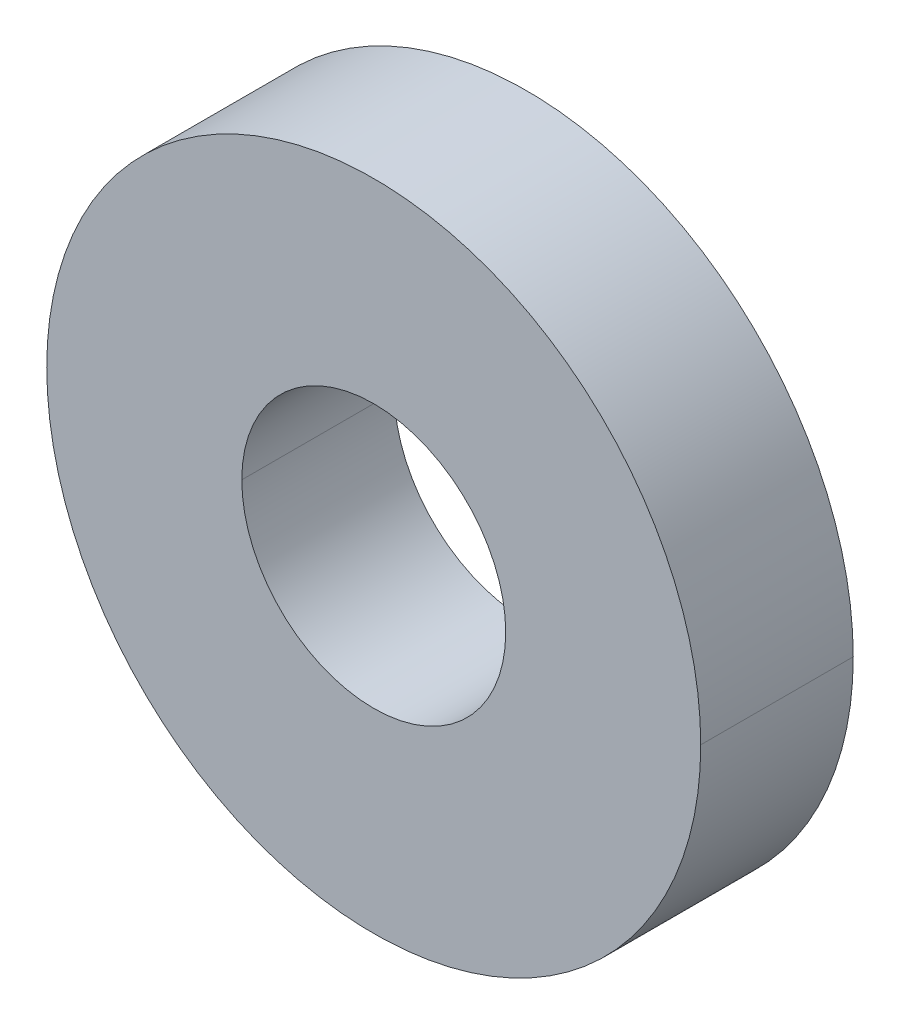
ISO-10303-21;
HEADER;
FILE_DESCRIPTION(('STEP AP214'),'2;1');
FILE_NAME('part.step','',(''),(''),'','','');
FILE_SCHEMA(('AUTOMOTIVE_DESIGN { 1 0 10303 214 1 1 1 1 }'));
ENDSEC;
DATA;
#1=APPLICATION_CONTEXT('core data for automotive mechanical design processes');
#2=APPLICATION_PROTOCOL_DEFINITION('international standard','automotive_design',2000,#1);
#3=PRODUCT_CONTEXT('',#1,'mechanical');
#4=PRODUCT('Part','Part','',(#3));
#5=PRODUCT_RELATED_PRODUCT_CATEGORY('part','',(#4));
#6=PRODUCT_DEFINITION_FORMATION('','',#4);
#7=PRODUCT_DEFINITION_CONTEXT('part definition',#1,'design');
#8=PRODUCT_DEFINITION('design','',#6,#7);
#9=PRODUCT_DEFINITION_SHAPE('','',#8);
#10=(LENGTH_UNIT() NAMED_UNIT(*) SI_UNIT(.MILLI.,.METRE.));
#11=(NAMED_UNIT(*) PLANE_ANGLE_UNIT() SI_UNIT($,.RADIAN.));
#12=(NAMED_UNIT(*) SI_UNIT($,.STERADIAN.) SOLID_ANGLE_UNIT());
#13=UNCERTAINTY_MEASURE_WITH_UNIT(LENGTH_MEASURE(1.E-05),#10,'distance_accuracy_value','');
#14=(GEOMETRIC_REPRESENTATION_CONTEXT(3) GLOBAL_UNCERTAINTY_ASSIGNED_CONTEXT((#13)) GLOBAL_UNIT_ASSIGNED_CONTEXT((#10,
#11,#12)) REPRESENTATION_CONTEXT('',''));
#15=CARTESIAN_POINT('',(0.,0.,0.));
#16=DIRECTION('',(0.,0.,1.));
#17=DIRECTION('',(1.,0.,0.));
#18=AXIS2_PLACEMENT_3D('',#15,#16,#17);
#19=CARTESIAN_POINT('',(0.,0.,5.2));
#20=DIRECTION('',(0.,0.,-1.));
#21=DIRECTION('',(-1.,0.,0.));
#22=AXIS2_PLACEMENT_3D('',#19,#20,#21);
#23=CYLINDRICAL_SURFACE('',#22,4.5);
#24=CARTESIAN_POINT('',(0.,0.,5.2));
#25=DIRECTION('',(0.,0.,1.));
#26=DIRECTION('',(1.,0.,0.));
#27=AXIS2_PLACEMENT_3D('',#24,#25,#26);
#28=CIRCLE('',#27,4.5);
#29=CARTESIAN_POINT('',(-4.5,0.,5.2));
#30=VERTEX_POINT('',#29);
#31=CARTESIAN_POINT('',(4.5,0.,5.2));
#32=VERTEX_POINT('',#31);
#33=EDGE_CURVE('E11',#30,#32,#28,.T.);
#34=ORIENTED_EDGE('',*,*,#33,.T.);
#35=DIRECTION('',(0.,0.,-1.));
#36=VECTOR('',#35,1.);
#37=CARTESIAN_POINT('',(4.5,0.,5.2));
#38=LINE('',#37,#36);
#39=CARTESIAN_POINT('',(4.5,0.,0.));
#40=VERTEX_POINT('',#39);
#41=EDGE_CURVE('E28',#32,#40,#38,.T.);
#42=ORIENTED_EDGE('',*,*,#41,.T.);
#43=CARTESIAN_POINT('',(0.,0.,0.));
#44=DIRECTION('',(0.,0.,1.));
#45=DIRECTION('',(1.,0.,0.));
#46=AXIS2_PLACEMENT_3D('',#43,#44,#45);
#47=CIRCLE('',#46,4.5);
#48=CARTESIAN_POINT('',(-4.5,0.,0.));
#49=VERTEX_POINT('',#48);
#50=EDGE_CURVE('E111',#49,#40,#47,.T.);
#51=ORIENTED_EDGE('',*,*,#50,.F.);
#52=DIRECTION('',(0.,0.,-1.));
#53=VECTOR('',#52,1.);
#54=CARTESIAN_POINT('',(-4.5,0.,5.2));
#55=LINE('',#54,#53);
#56=EDGE_CURVE('E97',#30,#49,#55,.T.);
#57=ORIENTED_EDGE('',*,*,#56,.F.);
#58=EDGE_LOOP('',(#34,#42,#51,#57));
#59=FACE_BOUND('',#58,.T.);
#60=ADVANCED_FACE('F17',(#59),#23,.F.);
#61=CARTESIAN_POINT('',(0.,0.,5.2));
#62=DIRECTION('',(0.,0.,-1.));
#63=DIRECTION('',(-1.,0.,0.));
#64=AXIS2_PLACEMENT_3D('',#61,#62,#63);
#65=CYLINDRICAL_SURFACE('',#64,11.15);
#66=CARTESIAN_POINT('',(0.,0.,5.2));
#67=DIRECTION('',(0.,0.,1.));
#68=DIRECTION('',(1.,0.,0.));
#69=AXIS2_PLACEMENT_3D('',#66,#67,#68);
#70=CIRCLE('',#69,11.15);
#71=CARTESIAN_POINT('',(11.15,0.,5.2));
#72=VERTEX_POINT('',#71);
#73=CARTESIAN_POINT('',(-11.15,0.,5.2));
#74=VERTEX_POINT('',#73);
#75=EDGE_CURVE('E113',#72,#74,#70,.T.);
#76=ORIENTED_EDGE('',*,*,#75,.F.);
#77=DIRECTION('',(0.,0.,-1.));
#78=VECTOR('',#77,1.);
#79=CARTESIAN_POINT('',(11.15,0.,5.2));
#80=LINE('',#79,#78);
#81=CARTESIAN_POINT('',(11.15,0.,0.));
#82=VERTEX_POINT('',#81);
#83=EDGE_CURVE('E84',#72,#82,#80,.T.);
#84=ORIENTED_EDGE('',*,*,#83,.T.);
#85=CARTESIAN_POINT('',(0.,0.,0.));
#86=DIRECTION('',(0.,0.,1.));
#87=DIRECTION('',(1.,0.,0.));
#88=AXIS2_PLACEMENT_3D('',#85,#86,#87);
#89=CIRCLE('',#88,11.15);
#90=CARTESIAN_POINT('',(-11.15,0.,0.));
#91=VERTEX_POINT('',#90);
#92=EDGE_CURVE('E82',#82,#91,#89,.T.);
#93=ORIENTED_EDGE('',*,*,#92,.T.);
#94=DIRECTION('',(0.,0.,-1.));
#95=VECTOR('',#94,1.);
#96=CARTESIAN_POINT('',(-11.15,0.,5.2));
#97=LINE('',#96,#95);
#98=EDGE_CURVE('E70',#74,#91,#97,.T.);
#99=ORIENTED_EDGE('',*,*,#98,.F.);
#100=EDGE_LOOP('',(#76,#84,#93,#99));
#101=FACE_BOUND('',#100,.T.);
#102=ADVANCED_FACE('F83',(#101),#65,.T.);
#103=CARTESIAN_POINT('',(0.,0.,5.2));
#104=DIRECTION('',(0.,0.,1.));
#105=DIRECTION('',(1.,0.,0.));
#106=AXIS2_PLACEMENT_3D('',#103,#104,#105);
#107=PLANE('',#106);
#108=CARTESIAN_POINT('',(0.,0.,5.2));
#109=DIRECTION('',(0.,0.,1.));
#110=DIRECTION('',(1.,0.,0.));
#111=AXIS2_PLACEMENT_3D('',#108,#109,#110);
#112=CIRCLE('',#111,11.15);
#113=EDGE_CURVE('E21',#74,#72,#112,.T.);
#114=ORIENTED_EDGE('',*,*,#113,.T.);
#115=ORIENTED_EDGE('',*,*,#75,.T.);
#116=EDGE_LOOP('',(#114,#115));
#117=FACE_BOUND('',#116,.T.);
#118=ORIENTED_EDGE('',*,*,#33,.F.);
#119=CARTESIAN_POINT('',(0.,0.,5.2));
#120=DIRECTION('',(0.,0.,1.));
#121=DIRECTION('',(1.,0.,0.));
#122=AXIS2_PLACEMENT_3D('',#119,#120,#121);
#123=CIRCLE('',#122,4.5);
#124=EDGE_CURVE('E91',#32,#30,#123,.T.);
#125=ORIENTED_EDGE('',*,*,#124,.F.);
#126=EDGE_LOOP('',(#118,#125));
#127=FACE_BOUND('',#126,.T.);
#128=ADVANCED_FACE('F129',(#117,#127),#107,.T.);
#129=CARTESIAN_POINT('',(0.,0.,0.));
#130=DIRECTION('',(0.,0.,1.));
#131=DIRECTION('',(1.,0.,0.));
#132=AXIS2_PLACEMENT_3D('',#129,#130,#131);
#133=PLANE('',#132);
#134=CARTESIAN_POINT('',(0.,0.,0.));
#135=DIRECTION('',(0.,0.,1.));
#136=DIRECTION('',(1.,0.,0.));
#137=AXIS2_PLACEMENT_3D('',#134,#135,#136);
#138=CIRCLE('',#137,11.15);
#139=EDGE_CURVE('E74',#91,#82,#138,.T.);
#140=ORIENTED_EDGE('',*,*,#139,.F.);
#141=ORIENTED_EDGE('',*,*,#92,.F.);
#142=EDGE_LOOP('',(#140,#141));
#143=FACE_BOUND('',#142,.T.);
#144=ORIENTED_EDGE('',*,*,#50,.T.);
#145=CARTESIAN_POINT('',(0.,0.,0.));
#146=DIRECTION('',(0.,0.,1.));
#147=DIRECTION('',(1.,0.,0.));
#148=AXIS2_PLACEMENT_3D('',#145,#146,#147);
#149=CIRCLE('',#148,4.5);
#150=EDGE_CURVE('E79',#40,#49,#149,.T.);
#151=ORIENTED_EDGE('',*,*,#150,.T.);
#152=EDGE_LOOP('',(#144,#151));
#153=FACE_BOUND('',#152,.T.);
#154=ADVANCED_FACE('F88',(#143,#153),#133,.F.);
#155=CARTESIAN_POINT('',(0.,0.,5.2));
#156=DIRECTION('',(0.,0.,-1.));
#157=DIRECTION('',(-1.,0.,0.));
#158=AXIS2_PLACEMENT_3D('',#155,#156,#157);
#159=CYLINDRICAL_SURFACE('',#158,11.15);
#160=ORIENTED_EDGE('',*,*,#83,.F.);
#161=ORIENTED_EDGE('',*,*,#113,.F.);
#162=ORIENTED_EDGE('',*,*,#98,.T.);
#163=ORIENTED_EDGE('',*,*,#139,.T.);
#164=EDGE_LOOP('',(#160,#161,#162,#163));
#165=FACE_BOUND('',#164,.T.);
#166=ADVANCED_FACE('F19',(#165),#159,.T.);
#167=CARTESIAN_POINT('',(0.,0.,5.2));
#168=DIRECTION('',(0.,0.,-1.));
#169=DIRECTION('',(-1.,0.,0.));
#170=AXIS2_PLACEMENT_3D('',#167,#168,#169);
#171=CYLINDRICAL_SURFACE('',#170,4.5);
#172=ORIENTED_EDGE('',*,*,#41,.F.);
#173=ORIENTED_EDGE('',*,*,#124,.T.);
#174=ORIENTED_EDGE('',*,*,#56,.T.);
#175=ORIENTED_EDGE('',*,*,#150,.F.);
#176=EDGE_LOOP('',(#172,#173,#174,#175));
#177=FACE_BOUND('',#176,.T.);
#178=ADVANCED_FACE('F106',(#177),#171,.F.);
#179=CLOSED_SHELL('',(#60,#102,#128,#154,#166,#178));
#180=MANIFOLD_SOLID_BREP('B1',#179);
#181=ADVANCED_BREP_SHAPE_REPRESENTATION('',(#18,#180),#14);
#182=SHAPE_DEFINITION_REPRESENTATION(#9,#181);
ENDSEC;
END-ISO-10303-21;
